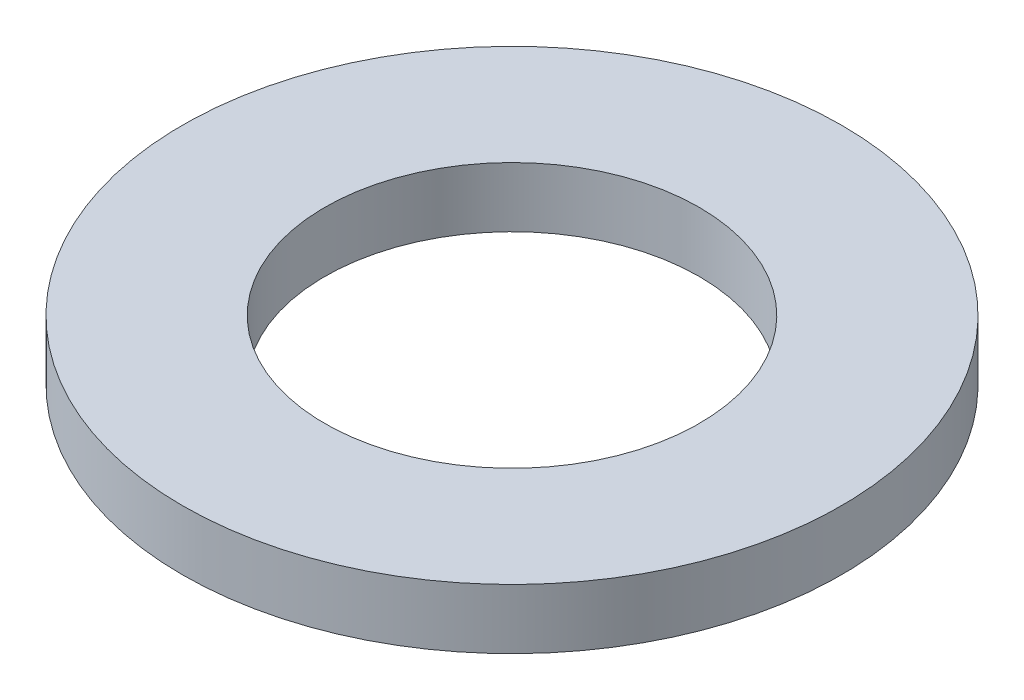
ISO-10303-21;
HEADER;
FILE_DESCRIPTION(('STEP AP214'),'2;1');
FILE_NAME('part.step','',(''),(''),'','','');
FILE_SCHEMA(('AUTOMOTIVE_DESIGN { 1 0 10303 214 1 1 1 1 }'));
ENDSEC;
DATA;
#1=APPLICATION_CONTEXT('core data for automotive mechanical design processes');
#2=APPLICATION_PROTOCOL_DEFINITION('international standard','automotive_design',2000,#1);
#3=PRODUCT_CONTEXT('',#1,'mechanical');
#4=PRODUCT('Part','Part','',(#3));
#5=PRODUCT_RELATED_PRODUCT_CATEGORY('part','',(#4));
#6=PRODUCT_DEFINITION_FORMATION('','',#4);
#7=PRODUCT_DEFINITION_CONTEXT('part definition',#1,'design');
#8=PRODUCT_DEFINITION('design','',#6,#7);
#9=PRODUCT_DEFINITION_SHAPE('','',#8);
#10=(LENGTH_UNIT() NAMED_UNIT(*) SI_UNIT(.MILLI.,.METRE.));
#11=(NAMED_UNIT(*) PLANE_ANGLE_UNIT() SI_UNIT($,.RADIAN.));
#12=(NAMED_UNIT(*) SI_UNIT($,.STERADIAN.) SOLID_ANGLE_UNIT());
#13=UNCERTAINTY_MEASURE_WITH_UNIT(LENGTH_MEASURE(1.E-05),#10,'distance_accuracy_value','');
#14=(GEOMETRIC_REPRESENTATION_CONTEXT(3) GLOBAL_UNCERTAINTY_ASSIGNED_CONTEXT((#13)) GLOBAL_UNIT_ASSIGNED_CONTEXT((#10,
#11,#12)) REPRESENTATION_CONTEXT('',''));
#15=CARTESIAN_POINT('',(0.,0.,0.));
#16=DIRECTION('',(0.,0.,1.));
#17=DIRECTION('',(1.,0.,0.));
#18=AXIS2_PLACEMENT_3D('',#15,#16,#17);
#19=CARTESIAN_POINT('',(0.,0.,0.));
#20=DIRECTION('',(0.,-1.,0.));
#21=DIRECTION('',(0.,0.,-1.));
#22=AXIS2_PLACEMENT_3D('',#19,#20,#21);
#23=CYLINDRICAL_SURFACE('',#22,12.5);
#24=CARTESIAN_POINT('',(0.,12.6445070422535,0.));
#25=DIRECTION('',(0.,-1.,0.));
#26=DIRECTION('',(0.,0.,-1.));
#27=AXIS2_PLACEMENT_3D('',#24,#25,#26);
#28=CIRCLE('',#27,12.5);
#29=CARTESIAN_POINT('',(0.,12.6445070422535,-12.5));
#30=VERTEX_POINT('',#29);
#31=EDGE_CURVE('E10',#30,#30,#28,.T.);
#32=ORIENTED_EDGE('',*,*,#31,.F.);
#33=EDGE_LOOP('',(#32));
#34=FACE_BOUND('',#33,.T.);
#35=CARTESIAN_POINT('',(0.,8.64450704225353,0.));
#36=DIRECTION('',(0.,-1.,0.));
#37=DIRECTION('',(0.,0.,-1.));
#38=AXIS2_PLACEMENT_3D('',#35,#36,#37);
#39=CIRCLE('',#38,12.5);
#40=CARTESIAN_POINT('',(0.,8.64450704225353,-12.5));
#41=VERTEX_POINT('',#40);
#42=EDGE_CURVE('E52',#41,#41,#39,.T.);
#43=ORIENTED_EDGE('',*,*,#42,.T.);
#44=EDGE_LOOP('',(#43));
#45=FACE_BOUND('',#44,.T.);
#46=ADVANCED_FACE('F34',(#34,#45),#23,.F.);
#47=CARTESIAN_POINT('',(-12.5,12.6445070422535,0.));
#48=DIRECTION('',(0.,-1.,0.));
#49=DIRECTION('',(0.,0.,-1.));
#50=AXIS2_PLACEMENT_3D('',#47,#48,#49);
#51=PLANE('',#50);
#52=CARTESIAN_POINT('',(0.,12.6445070422535,0.));
#53=DIRECTION('',(0.,-1.,0.));
#54=DIRECTION('',(0.,0.,-1.));
#55=AXIS2_PLACEMENT_3D('',#52,#53,#54);
#56=CIRCLE('',#55,22.);
#57=CARTESIAN_POINT('',(0.,12.6445070422535,-22.));
#58=VERTEX_POINT('',#57);
#59=EDGE_CURVE('E40',#58,#58,#56,.T.);
#60=ORIENTED_EDGE('',*,*,#59,.F.);
#61=EDGE_LOOP('',(#60));
#62=FACE_BOUND('',#61,.T.);
#63=ORIENTED_EDGE('',*,*,#31,.T.);
#64=EDGE_LOOP('',(#63));
#65=FACE_BOUND('',#64,.T.);
#66=ADVANCED_FACE('F69',(#62,#65),#51,.F.);
#67=CARTESIAN_POINT('',(0.,0.,0.));
#68=DIRECTION('',(0.,-1.,0.));
#69=DIRECTION('',(0.,0.,-1.));
#70=AXIS2_PLACEMENT_3D('',#67,#68,#69);
#71=CYLINDRICAL_SURFACE('',#70,22.);
#72=CARTESIAN_POINT('',(0.,8.64450704225353,0.));
#73=DIRECTION('',(0.,-1.,0.));
#74=DIRECTION('',(0.,0.,-1.));
#75=AXIS2_PLACEMENT_3D('',#72,#73,#74);
#76=CIRCLE('',#75,22.);
#77=CARTESIAN_POINT('',(0.,8.64450704225353,-22.));
#78=VERTEX_POINT('',#77);
#79=EDGE_CURVE('E45',#78,#78,#76,.T.);
#80=ORIENTED_EDGE('',*,*,#79,.F.);
#81=EDGE_LOOP('',(#80));
#82=FACE_BOUND('',#81,.T.);
#83=ORIENTED_EDGE('',*,*,#59,.T.);
#84=EDGE_LOOP('',(#83));
#85=FACE_BOUND('',#84,.T.);
#86=ADVANCED_FACE('F64',(#82,#85),#71,.T.);
#87=CARTESIAN_POINT('',(-12.5,8.64450704225353,0.));
#88=DIRECTION('',(0.,1.,0.));
#89=DIRECTION('',(0.,0.,1.));
#90=AXIS2_PLACEMENT_3D('',#87,#88,#89);
#91=PLANE('',#90);
#92=ORIENTED_EDGE('',*,*,#42,.F.);
#93=EDGE_LOOP('',(#92));
#94=FACE_BOUND('',#93,.T.);
#95=ORIENTED_EDGE('',*,*,#79,.T.);
#96=EDGE_LOOP('',(#95));
#97=FACE_BOUND('',#96,.T.);
#98=ADVANCED_FACE('F61',(#94,#97),#91,.F.);
#99=CLOSED_SHELL('',(#46,#66,#86,#98));
#100=MANIFOLD_SOLID_BREP('B2',#99);
#101=ADVANCED_BREP_SHAPE_REPRESENTATION('',(#18,#100),#14);
#102=SHAPE_DEFINITION_REPRESENTATION(#9,#101);
ENDSEC;
END-ISO-10303-21;
